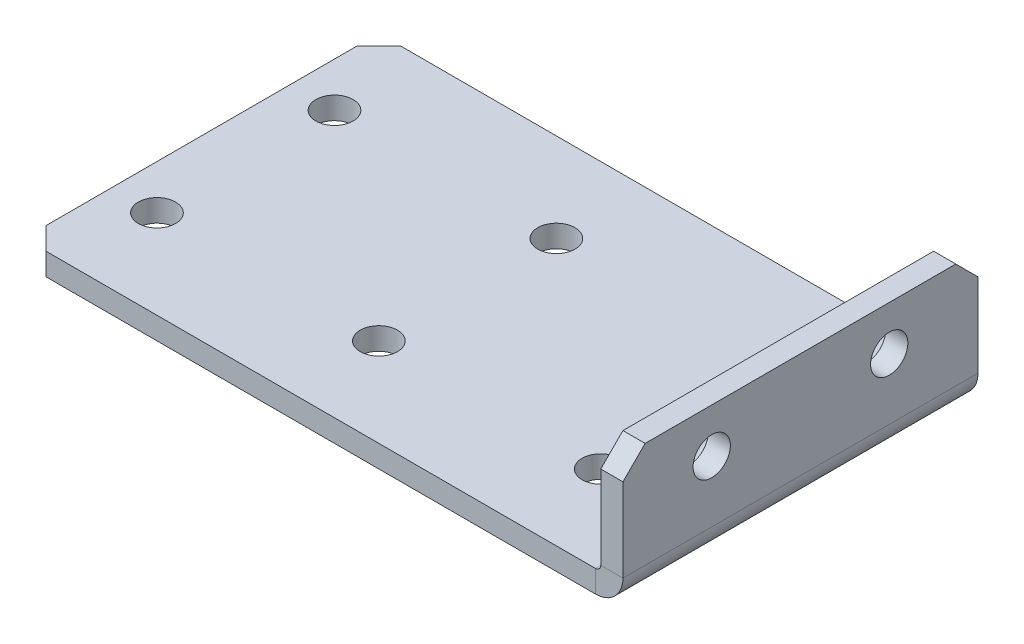
ISO-10303-21;
HEADER;
FILE_DESCRIPTION(('STEP AP214'),'2;1');
FILE_NAME('part.step','',(''),(''),'','','');
FILE_SCHEMA(('AUTOMOTIVE_DESIGN { 1 0 10303 214 1 1 1 1 }'));
ENDSEC;
DATA;
#1=APPLICATION_CONTEXT('core data for automotive mechanical design processes');
#2=APPLICATION_PROTOCOL_DEFINITION('international standard','automotive_design',2000,#1);
#3=PRODUCT_CONTEXT('',#1,'mechanical');
#4=PRODUCT('Part','Part','',(#3));
#5=PRODUCT_RELATED_PRODUCT_CATEGORY('part','',(#4));
#6=PRODUCT_DEFINITION_FORMATION('','',#4);
#7=PRODUCT_DEFINITION_CONTEXT('part definition',#1,'design');
#8=PRODUCT_DEFINITION('design','',#6,#7);
#9=PRODUCT_DEFINITION_SHAPE('','',#8);
#10=(LENGTH_UNIT() NAMED_UNIT(*) SI_UNIT(.MILLI.,.METRE.));
#11=(NAMED_UNIT(*) PLANE_ANGLE_UNIT() SI_UNIT($,.RADIAN.));
#12=(NAMED_UNIT(*) SI_UNIT($,.STERADIAN.) SOLID_ANGLE_UNIT());
#13=UNCERTAINTY_MEASURE_WITH_UNIT(LENGTH_MEASURE(1.E-05),#10,'distance_accuracy_value','');
#14=(GEOMETRIC_REPRESENTATION_CONTEXT(3) GLOBAL_UNCERTAINTY_ASSIGNED_CONTEXT((#13)) GLOBAL_UNIT_ASSIGNED_CONTEXT((#10,
#11,#12)) REPRESENTATION_CONTEXT('',''));
#15=CARTESIAN_POINT('',(0.,0.,0.));
#16=DIRECTION('',(0.,0.,1.));
#17=DIRECTION('',(1.,0.,0.));
#18=AXIS2_PLACEMENT_3D('',#15,#16,#17);
#19=CARTESIAN_POINT('',(82.5499999999997,-81.5415859698046,0.));
#20=DIRECTION('',(1.,0.,0.));
#21=DIRECTION('',(0.,0.,-1.));
#22=AXIS2_PLACEMENT_3D('',#19,#20,#21);
#23=PLANE('',#22);
#24=CARTESIAN_POINT('',(82.5500000000007,12.7000000000001,-50.8));
#25=DIRECTION('',(-1.,0.,0.));
#26=DIRECTION('',(0.,0.,1.));
#27=AXIS2_PLACEMENT_3D('',#24,#25,#26);
#28=CIRCLE('',#27,2.66699999999999);
#29=CARTESIAN_POINT('',(82.5500000000006,12.7000000000001,-48.133));
#30=VERTEX_POINT('',#29);
#31=EDGE_CURVE('E271',#30,#30,#28,.T.);
#32=ORIENTED_EDGE('',*,*,#31,.F.);
#33=EDGE_LOOP('',(#32));
#34=FACE_BOUND('',#33,.T.);
#35=CARTESIAN_POINT('',(82.5500000000006,12.7000000000001,-25.4));
#36=DIRECTION('',(-1.,0.,0.));
#37=DIRECTION('',(0.,0.,1.));
#38=AXIS2_PLACEMENT_3D('',#35,#36,#37);
#39=CIRCLE('',#38,2.66699999999999);
#40=CARTESIAN_POINT('',(82.5500000000005,12.7000000000001,-22.733));
#41=VERTEX_POINT('',#40);
#42=EDGE_CURVE('E262',#41,#41,#39,.T.);
#43=ORIENTED_EDGE('',*,*,#42,.F.);
#44=EDGE_LOOP('',(#43));
#45=FACE_BOUND('',#44,.T.);
#46=DIRECTION('',(0.,1.,0.));
#47=VECTOR('',#46,1.);
#48=CARTESIAN_POINT('',(82.5499999999997,-78.3665859698046,-63.5));
#49=LINE('',#48,#47);
#50=CARTESIAN_POINT('',(82.55,3.93699999999998,-63.5));
#51=VERTEX_POINT('',#50);
#52=CARTESIAN_POINT('',(82.55,15.875,-63.5));
#53=VERTEX_POINT('',#52);
#54=EDGE_CURVE('E67',#51,#53,#49,.T.);
#55=ORIENTED_EDGE('',*,*,#54,.F.);
#56=DIRECTION('',(0.,0.,1.));
#57=VECTOR('',#56,1.);
#58=CARTESIAN_POINT('',(82.55,3.93699999999997,0.));
#59=LINE('',#58,#57);
#60=CARTESIAN_POINT('',(82.55,3.93699999999997,-12.7));
#61=VERTEX_POINT('',#60);
#62=EDGE_CURVE('E56',#51,#61,#59,.T.);
#63=ORIENTED_EDGE('',*,*,#62,.T.);
#64=DIRECTION('',(0.,-1.,0.));
#65=VECTOR('',#64,1.);
#66=CARTESIAN_POINT('',(82.55,15.875,-12.7));
#67=LINE('',#66,#65);
#68=CARTESIAN_POINT('',(82.55,15.875,-12.7));
#69=VERTEX_POINT('',#68);
#70=EDGE_CURVE('E78',#69,#61,#67,.T.);
#71=ORIENTED_EDGE('',*,*,#70,.F.);
#72=DIRECTION('',(0.,-0.70710678118655,0.707106781186546));
#73=VECTOR('',#72,1.);
#74=CARTESIAN_POINT('',(82.5500000000001,19.05,-15.875));
#75=LINE('',#74,#73);
#76=CARTESIAN_POINT('',(82.5500000000001,19.05,-15.875));
#77=VERTEX_POINT('',#76);
#78=EDGE_CURVE('E280',#77,#69,#75,.T.);
#79=ORIENTED_EDGE('',*,*,#78,.F.);
#80=DIRECTION('',(0.,0.,1.));
#81=VECTOR('',#80,1.);
#82=CARTESIAN_POINT('',(82.55,19.05,-60.325));
#83=LINE('',#82,#81);
#84=CARTESIAN_POINT('',(82.55,19.05,-60.325));
#85=VERTEX_POINT('',#84);
#86=EDGE_CURVE('E289',#85,#77,#83,.T.);
#87=ORIENTED_EDGE('',*,*,#86,.F.);
#88=DIRECTION('',(0.,0.707106781186547,0.707106781186548));
#89=VECTOR('',#88,1.);
#90=CARTESIAN_POINT('',(82.55,15.875,-63.5));
#91=LINE('',#90,#89);
#92=EDGE_CURVE('E285',#53,#85,#91,.T.);
#93=ORIENTED_EDGE('',*,*,#92,.F.);
#94=EDGE_LOOP('',(#55,#63,#71,#79,#87,#93));
#95=FACE_BOUND('',#94,.T.);
#96=ADVANCED_FACE('F46',(#34,#45,#95),#23,.F.);
#97=CARTESIAN_POINT('',(82.5500000000001,19.05,-15.875));
#98=DIRECTION('',(0.,0.707106781186545,0.707106781186549));
#99=DIRECTION('',(0.,0.70710678118655,-0.707106781186546));
#100=AXIS2_PLACEMENT_3D('',#97,#98,#99);
#101=PLANE('',#100);
#102=DIRECTION('',(0.,-0.70710678118655,0.707106781186546));
#103=VECTOR('',#102,1.);
#104=CARTESIAN_POINT('',(85.725,19.05,-15.875));
#105=LINE('',#104,#103);
#106=CARTESIAN_POINT('',(85.725,19.05,-15.875));
#107=VERTEX_POINT('',#106);
#108=CARTESIAN_POINT('',(85.725,15.875,-12.7));
#109=VERTEX_POINT('',#108);
#110=EDGE_CURVE('E279',#107,#109,#105,.T.);
#111=ORIENTED_EDGE('',*,*,#110,.F.);
#112=DIRECTION('',(1.,0.,0.));
#113=VECTOR('',#112,1.);
#114=CARTESIAN_POINT('',(82.5500000000001,19.05,-15.875));
#115=LINE('',#114,#113);
#116=EDGE_CURVE('E305',#77,#107,#115,.T.);
#117=ORIENTED_EDGE('',*,*,#116,.F.);
#118=ORIENTED_EDGE('',*,*,#78,.T.);
#119=DIRECTION('',(1.,0.,0.));
#120=VECTOR('',#119,1.);
#121=CARTESIAN_POINT('',(82.55,15.875,-12.7));
#122=LINE('',#121,#120);
#123=EDGE_CURVE('E293',#69,#109,#122,.T.);
#124=ORIENTED_EDGE('',*,*,#123,.T.);
#125=EDGE_LOOP('',(#111,#117,#118,#124));
#126=FACE_BOUND('',#125,.T.);
#127=ADVANCED_FACE('F346',(#126),#101,.T.);
#128=CARTESIAN_POINT('',(82.55,19.05,-60.325));
#129=DIRECTION('',(0.,1.,0.));
#130=DIRECTION('',(0.,0.,-1.));
#131=AXIS2_PLACEMENT_3D('',#128,#129,#130);
#132=PLANE('',#131);
#133=DIRECTION('',(0.,0.,1.));
#134=VECTOR('',#133,1.);
#135=CARTESIAN_POINT('',(85.725,19.05,-60.325));
#136=LINE('',#135,#134);
#137=CARTESIAN_POINT('',(85.725,19.05,-60.325));
#138=VERTEX_POINT('',#137);
#139=EDGE_CURVE('E284',#138,#107,#136,.T.);
#140=ORIENTED_EDGE('',*,*,#139,.F.);
#141=DIRECTION('',(1.,0.,0.));
#142=VECTOR('',#141,1.);
#143=CARTESIAN_POINT('',(82.55,19.05,-60.325));
#144=LINE('',#143,#142);
#145=EDGE_CURVE('E308',#85,#138,#144,.T.);
#146=ORIENTED_EDGE('',*,*,#145,.F.);
#147=ORIENTED_EDGE('',*,*,#86,.T.);
#148=ORIENTED_EDGE('',*,*,#116,.T.);
#149=EDGE_LOOP('',(#140,#146,#147,#148));
#150=FACE_BOUND('',#149,.T.);
#151=ADVANCED_FACE('F343',(#150),#132,.T.);
#152=CARTESIAN_POINT('',(82.55,15.875,-63.5));
#153=DIRECTION('',(0.,0.707106781186548,-0.707106781186547));
#154=DIRECTION('',(0.,-0.707106781186547,-0.707106781186548));
#155=AXIS2_PLACEMENT_3D('',#152,#153,#154);
#156=PLANE('',#155);
#157=DIRECTION('',(0.,0.707106781186547,0.707106781186548));
#158=VECTOR('',#157,1.);
#159=CARTESIAN_POINT('',(85.725,15.875,-63.5));
#160=LINE('',#159,#158);
#161=CARTESIAN_POINT('',(85.725,15.875,-63.5));
#162=VERTEX_POINT('',#161);
#163=EDGE_CURVE('E298',#162,#138,#160,.T.);
#164=ORIENTED_EDGE('',*,*,#163,.F.);
#165=DIRECTION('',(1.,0.,0.));
#166=VECTOR('',#165,1.);
#167=CARTESIAN_POINT('',(82.55,15.875,-63.5));
#168=LINE('',#167,#166);
#169=EDGE_CURVE('E311',#53,#162,#168,.T.);
#170=ORIENTED_EDGE('',*,*,#169,.F.);
#171=ORIENTED_EDGE('',*,*,#92,.T.);
#172=ORIENTED_EDGE('',*,*,#145,.T.);
#173=EDGE_LOOP('',(#164,#170,#171,#172));
#174=FACE_BOUND('',#173,.T.);
#175=ADVANCED_FACE('F340',(#174),#156,.T.);
#176=CARTESIAN_POINT('',(82.5499999999997,-78.3665859698046,-63.5));
#177=DIRECTION('',(0.,0.,-1.));
#178=DIRECTION('',(0.,-1.,0.));
#179=AXIS2_PLACEMENT_3D('',#176,#177,#178);
#180=PLANE('',#179);
#181=DIRECTION('',(1.,0.,0.));
#182=VECTOR('',#181,1.);
#183=CARTESIAN_POINT('',(82.55,3.93699999999997,-63.5));
#184=LINE('',#183,#182);
#185=CARTESIAN_POINT('',(85.725,3.93699999999997,-63.5));
#186=VERTEX_POINT('',#185);
#187=EDGE_CURVE('E12',#51,#186,#184,.T.);
#188=ORIENTED_EDGE('',*,*,#187,.F.);
#189=ORIENTED_EDGE('',*,*,#54,.T.);
#190=ORIENTED_EDGE('',*,*,#169,.T.);
#191=DIRECTION('',(0.,1.,0.));
#192=VECTOR('',#191,1.);
#193=CARTESIAN_POINT('',(85.7249999999997,-78.3665859698046,-63.5));
#194=LINE('',#193,#192);
#195=EDGE_CURVE('E50',#186,#162,#194,.T.);
#196=ORIENTED_EDGE('',*,*,#195,.F.);
#197=EDGE_LOOP('',(#188,#189,#190,#196));
#198=FACE_BOUND('',#197,.T.);
#199=ADVANCED_FACE('F48',(#198),#180,.T.);
#200=CARTESIAN_POINT('',(82.55,15.875,-12.7));
#201=DIRECTION('',(0.,0.,1.));
#202=DIRECTION('',(0.,1.,0.));
#203=AXIS2_PLACEMENT_3D('',#200,#201,#202);
#204=PLANE('',#203);
#205=DIRECTION('',(-1.,0.,0.));
#206=VECTOR('',#205,1.);
#207=CARTESIAN_POINT('',(82.55,3.93699999999997,-12.7));
#208=LINE('',#207,#206);
#209=CARTESIAN_POINT('',(85.725,3.93699999999994,-12.7));
#210=VERTEX_POINT('',#209);
#211=EDGE_CURVE('E319',#210,#61,#208,.T.);
#212=ORIENTED_EDGE('',*,*,#211,.F.);
#213=DIRECTION('',(0.,-1.,0.));
#214=VECTOR('',#213,1.);
#215=CARTESIAN_POINT('',(85.725,15.875,-12.7));
#216=LINE('',#215,#214);
#217=EDGE_CURVE('E297',#109,#210,#216,.T.);
#218=ORIENTED_EDGE('',*,*,#217,.F.);
#219=ORIENTED_EDGE('',*,*,#123,.F.);
#220=ORIENTED_EDGE('',*,*,#70,.T.);
#221=EDGE_LOOP('',(#212,#218,#219,#220));
#222=FACE_BOUND('',#221,.T.);
#223=ADVANCED_FACE('F348',(#222),#204,.T.);
#224=CARTESIAN_POINT('',(85.7249999999997,-81.5415859698046,0.));
#225=DIRECTION('',(1.,0.,0.));
#226=DIRECTION('',(0.,0.,-1.));
#227=AXIS2_PLACEMENT_3D('',#224,#225,#226);
#228=PLANE('',#227);
#229=DIRECTION('',(0.,0.,1.));
#230=VECTOR('',#229,1.);
#231=CARTESIAN_POINT('',(85.725,3.93699999999995,0.));
#232=LINE('',#231,#230);
#233=EDGE_CURVE('E183',#186,#210,#232,.T.);
#234=ORIENTED_EDGE('',*,*,#233,.F.);
#235=ORIENTED_EDGE('',*,*,#195,.T.);
#236=ORIENTED_EDGE('',*,*,#163,.T.);
#237=ORIENTED_EDGE('',*,*,#139,.T.);
#238=ORIENTED_EDGE('',*,*,#110,.T.);
#239=ORIENTED_EDGE('',*,*,#217,.T.);
#240=EDGE_LOOP('',(#234,#235,#236,#237,#238,#239));
#241=FACE_BOUND('',#240,.T.);
#242=CARTESIAN_POINT('',(85.7250000000005,12.7,-25.4));
#243=DIRECTION('',(-1.,0.,0.));
#244=DIRECTION('',(0.,0.,1.));
#245=AXIS2_PLACEMENT_3D('',#242,#243,#244);
#246=CIRCLE('',#245,2.66699999999999);
#247=CARTESIAN_POINT('',(85.7250000000005,12.7,-22.733));
#248=VERTEX_POINT('',#247);
#249=EDGE_CURVE('E266',#248,#248,#246,.T.);
#250=ORIENTED_EDGE('',*,*,#249,.T.);
#251=EDGE_LOOP('',(#250));
#252=FACE_BOUND('',#251,.T.);
#253=CARTESIAN_POINT('',(85.7250000000006,12.7000000000001,-50.8));
#254=DIRECTION('',(-1.,0.,0.));
#255=DIRECTION('',(0.,0.,1.));
#256=AXIS2_PLACEMENT_3D('',#253,#254,#255);
#257=CIRCLE('',#256,2.66699999999999);
#258=CARTESIAN_POINT('',(85.7250000000006,12.7000000000001,-48.133));
#259=VERTEX_POINT('',#258);
#260=EDGE_CURVE('E275',#259,#259,#257,.T.);
#261=ORIENTED_EDGE('',*,*,#260,.T.);
#262=EDGE_LOOP('',(#261));
#263=FACE_BOUND('',#262,.T.);
#264=ADVANCED_FACE('F333',(#241,#252,#263),#228,.T.);
#265=CARTESIAN_POINT('',(82.5500000000007,12.7000000000001,-50.8));
#266=DIRECTION('',(-1.,0.,0.));
#267=DIRECTION('',(0.,0.,1.));
#268=AXIS2_PLACEMENT_3D('',#265,#266,#267);
#269=CYLINDRICAL_SURFACE('',#268,2.66699999999999);
#270=ORIENTED_EDGE('',*,*,#260,.F.);
#271=EDGE_LOOP('',(#270));
#272=FACE_BOUND('',#271,.T.);
#273=ORIENTED_EDGE('',*,*,#31,.T.);
#274=EDGE_LOOP('',(#273));
#275=FACE_BOUND('',#274,.T.);
#276=ADVANCED_FACE('F435',(#272,#275),#269,.F.);
#277=CARTESIAN_POINT('',(82.5500000000006,12.7000000000001,-25.4));
#278=DIRECTION('',(-1.,0.,0.));
#279=DIRECTION('',(0.,0.,1.));
#280=AXIS2_PLACEMENT_3D('',#277,#278,#279);
#281=CYLINDRICAL_SURFACE('',#280,2.66699999999999);
#282=ORIENTED_EDGE('',*,*,#249,.F.);
#283=EDGE_LOOP('',(#282));
#284=FACE_BOUND('',#283,.T.);
#285=ORIENTED_EDGE('',*,*,#42,.T.);
#286=EDGE_LOOP('',(#285));
#287=FACE_BOUND('',#286,.T.);
#288=ADVANCED_FACE('F443',(#284,#287),#281,.F.);
#289=CARTESIAN_POINT('',(0.,3.17499999999997,-60.325));
#290=DIRECTION('',(-0.707106781186547,0.,-0.707106781186547));
#291=DIRECTION('',(-0.707106781186548,0.,0.707106781186548));
#292=AXIS2_PLACEMENT_3D('',#289,#290,#291);
#293=PLANE('',#292);
#294=DIRECTION('',(0.707106781186547,0.,-0.707106781186548));
#295=VECTOR('',#294,1.);
#296=CARTESIAN_POINT('',(0.,0.,-60.325));
#297=LINE('',#296,#295);
#298=CARTESIAN_POINT('',(0.,0.,-60.325));
#299=VERTEX_POINT('',#298);
#300=CARTESIAN_POINT('',(3.17500000000001,0.,-63.5));
#301=VERTEX_POINT('',#300);
#302=EDGE_CURVE('E174',#299,#301,#297,.T.);
#303=ORIENTED_EDGE('',*,*,#302,.F.);
#304=DIRECTION('',(0.,-1.,0.));
#305=VECTOR('',#304,1.);
#306=CARTESIAN_POINT('',(0.,3.17499999999997,-60.325));
#307=LINE('',#306,#305);
#308=CARTESIAN_POINT('',(0.,3.17499999999997,-60.325));
#309=VERTEX_POINT('',#308);
#310=EDGE_CURVE('E247',#309,#299,#307,.T.);
#311=ORIENTED_EDGE('',*,*,#310,.F.);
#312=DIRECTION('',(0.707106781186547,0.,-0.707106781186548));
#313=VECTOR('',#312,1.);
#314=CARTESIAN_POINT('',(0.,3.17499999999997,-60.325));
#315=LINE('',#314,#313);
#316=CARTESIAN_POINT('',(3.17500000000001,3.17499999999997,-63.5));
#317=VERTEX_POINT('',#316);
#318=EDGE_CURVE('E257',#309,#317,#315,.T.);
#319=ORIENTED_EDGE('',*,*,#318,.T.);
#320=DIRECTION('',(0.,-1.,0.));
#321=VECTOR('',#320,1.);
#322=CARTESIAN_POINT('',(3.17500000000001,3.17499999999997,-63.5));
#323=LINE('',#322,#321);
#324=EDGE_CURVE('E254',#317,#301,#323,.T.);
#325=ORIENTED_EDGE('',*,*,#324,.T.);
#326=EDGE_LOOP('',(#303,#311,#319,#325));
#327=FACE_BOUND('',#326,.T.);
#328=ADVANCED_FACE('F407',(#327),#293,.T.);
#329=CARTESIAN_POINT('',(0.,3.17499999999997,-15.875));
#330=DIRECTION('',(-1.,0.,0.));
#331=DIRECTION('',(0.,0.,1.));
#332=AXIS2_PLACEMENT_3D('',#329,#330,#331);
#333=PLANE('',#332);
#334=DIRECTION('',(0.,0.,-1.));
#335=VECTOR('',#334,1.);
#336=CARTESIAN_POINT('',(0.,0.,-15.875));
#337=LINE('',#336,#335);
#338=CARTESIAN_POINT('',(0.,0.,-15.875));
#339=VERTEX_POINT('',#338);
#340=EDGE_CURVE('E210',#339,#299,#337,.T.);
#341=ORIENTED_EDGE('',*,*,#340,.F.);
#342=DIRECTION('',(0.,-1.,0.));
#343=VECTOR('',#342,1.);
#344=CARTESIAN_POINT('',(0.,3.17499999999997,-15.875));
#345=LINE('',#344,#343);
#346=CARTESIAN_POINT('',(0.,3.17499999999997,-15.875));
#347=VERTEX_POINT('',#346);
#348=EDGE_CURVE('E240',#347,#339,#345,.T.);
#349=ORIENTED_EDGE('',*,*,#348,.F.);
#350=DIRECTION('',(0.,0.,-1.));
#351=VECTOR('',#350,1.);
#352=CARTESIAN_POINT('',(0.,3.17499999999997,-15.875));
#353=LINE('',#352,#351);
#354=EDGE_CURVE('E250',#347,#309,#353,.T.);
#355=ORIENTED_EDGE('',*,*,#354,.T.);
#356=ORIENTED_EDGE('',*,*,#310,.T.);
#357=EDGE_LOOP('',(#341,#349,#355,#356));
#358=FACE_BOUND('',#357,.T.);
#359=ADVANCED_FACE('F403',(#358),#333,.T.);
#360=CARTESIAN_POINT('',(3.17500000000001,3.17499999999997,-12.7));
#361=DIRECTION('',(-0.707106781186547,0.,0.707106781186548));
#362=DIRECTION('',(0.707106781186548,0.,0.707106781186547));
#363=AXIS2_PLACEMENT_3D('',#360,#361,#362);
#364=PLANE('',#363);
#365=DIRECTION('',(-0.707106781186548,0.,-0.707106781186547));
#366=VECTOR('',#365,1.);
#367=CARTESIAN_POINT('',(3.17500000000001,0.,-12.7));
#368=LINE('',#367,#366);
#369=CARTESIAN_POINT('',(3.17500000000001,0.,-12.7));
#370=VERTEX_POINT('',#369);
#371=EDGE_CURVE('E205',#370,#339,#368,.T.);
#372=ORIENTED_EDGE('',*,*,#371,.F.);
#373=DIRECTION('',(0.,-1.,0.));
#374=VECTOR('',#373,1.);
#375=CARTESIAN_POINT('',(3.17500000000001,3.17499999999997,-12.7));
#376=LINE('',#375,#374);
#377=CARTESIAN_POINT('',(3.17500000000001,3.17499999999997,-12.7));
#378=VERTEX_POINT('',#377);
#379=EDGE_CURVE('E202',#378,#370,#376,.T.);
#380=ORIENTED_EDGE('',*,*,#379,.F.);
#381=DIRECTION('',(-0.707106781186548,0.,-0.707106781186547));
#382=VECTOR('',#381,1.);
#383=CARTESIAN_POINT('',(3.17500000000001,3.17499999999997,-12.7));
#384=LINE('',#383,#382);
#385=EDGE_CURVE('E243',#378,#347,#384,.T.);
#386=ORIENTED_EDGE('',*,*,#385,.T.);
#387=ORIENTED_EDGE('',*,*,#348,.T.);
#388=EDGE_LOOP('',(#372,#380,#386,#387));
#389=FACE_BOUND('',#388,.T.);
#390=ADVANCED_FACE('F479',(#389),#364,.T.);
#391=CARTESIAN_POINT('',(38.1,0.,-25.4));
#392=DIRECTION('',(0.,-1.,0.));
#393=DIRECTION('',(0.,0.,-1.));
#394=AXIS2_PLACEMENT_3D('',#391,#392,#393);
#395=CYLINDRICAL_SURFACE('',#394,2.66699999999999);
#396=CARTESIAN_POINT('',(38.1,3.17499999999997,-25.4));
#397=DIRECTION('',(0.,-1.,0.));
#398=DIRECTION('',(0.,0.,-1.));
#399=AXIS2_PLACEMENT_3D('',#396,#397,#398);
#400=CIRCLE('',#399,2.66699999999999);
#401=CARTESIAN_POINT('',(38.1,3.17499999999997,-28.067));
#402=VERTEX_POINT('',#401);
#403=EDGE_CURVE('E390',#402,#402,#400,.T.);
#404=ORIENTED_EDGE('',*,*,#403,.F.);
#405=EDGE_LOOP('',(#404));
#406=FACE_BOUND('',#405,.T.);
#407=CARTESIAN_POINT('',(38.1,0.,-25.4));
#408=DIRECTION('',(0.,-1.,0.));
#409=DIRECTION('',(0.,0.,-1.));
#410=AXIS2_PLACEMENT_3D('',#407,#408,#409);
#411=CIRCLE('',#410,2.66699999999999);
#412=CARTESIAN_POINT('',(38.1,0.,-28.067));
#413=VERTEX_POINT('',#412);
#414=EDGE_CURVE('E236',#413,#413,#411,.T.);
#415=ORIENTED_EDGE('',*,*,#414,.T.);
#416=EDGE_LOOP('',(#415));
#417=FACE_BOUND('',#416,.T.);
#418=ADVANCED_FACE('F475',(#406,#417),#395,.F.);
#419=CARTESIAN_POINT('',(38.1,0.,-50.8));
#420=DIRECTION('',(0.,-1.,0.));
#421=DIRECTION('',(0.,0.,-1.));
#422=AXIS2_PLACEMENT_3D('',#419,#420,#421);
#423=CYLINDRICAL_SURFACE('',#422,2.66699999999999);
#424=CARTESIAN_POINT('',(38.1,3.17499999999997,-50.8));
#425=DIRECTION('',(0.,-1.,0.));
#426=DIRECTION('',(0.,0.,-1.));
#427=AXIS2_PLACEMENT_3D('',#424,#425,#426);
#428=CIRCLE('',#427,2.66699999999999);
#429=CARTESIAN_POINT('',(38.1,3.17499999999997,-53.467));
#430=VERTEX_POINT('',#429);
#431=EDGE_CURVE('E386',#430,#430,#428,.T.);
#432=ORIENTED_EDGE('',*,*,#431,.F.);
#433=EDGE_LOOP('',(#432));
#434=FACE_BOUND('',#433,.T.);
#435=CARTESIAN_POINT('',(38.1,0.,-50.8));
#436=DIRECTION('',(0.,-1.,0.));
#437=DIRECTION('',(0.,0.,-1.));
#438=AXIS2_PLACEMENT_3D('',#435,#436,#437);
#439=CIRCLE('',#438,2.66699999999999);
#440=CARTESIAN_POINT('',(38.1,0.,-53.467));
#441=VERTEX_POINT('',#440);
#442=EDGE_CURVE('E232',#441,#441,#439,.T.);
#443=ORIENTED_EDGE('',*,*,#442,.T.);
#444=EDGE_LOOP('',(#443));
#445=FACE_BOUND('',#444,.T.);
#446=ADVANCED_FACE('F471',(#434,#445),#423,.F.);
#447=CARTESIAN_POINT('',(69.85,0.,-25.4));
#448=DIRECTION('',(0.,-1.,0.));
#449=DIRECTION('',(0.,0.,-1.));
#450=AXIS2_PLACEMENT_3D('',#447,#448,#449);
#451=CYLINDRICAL_SURFACE('',#450,2.66699999999999);
#452=CARTESIAN_POINT('',(69.85,3.17499999999997,-25.4));
#453=DIRECTION('',(0.,-1.,0.));
#454=DIRECTION('',(0.,0.,-1.));
#455=AXIS2_PLACEMENT_3D('',#452,#453,#454);
#456=CIRCLE('',#455,2.66699999999999);
#457=CARTESIAN_POINT('',(69.85,3.17499999999997,-28.067));
#458=VERTEX_POINT('',#457);
#459=EDGE_CURVE('E382',#458,#458,#456,.T.);
#460=ORIENTED_EDGE('',*,*,#459,.F.);
#461=EDGE_LOOP('',(#460));
#462=FACE_BOUND('',#461,.T.);
#463=CARTESIAN_POINT('',(69.85,0.,-25.4));
#464=DIRECTION('',(0.,-1.,0.));
#465=DIRECTION('',(0.,0.,-1.));
#466=AXIS2_PLACEMENT_3D('',#463,#464,#465);
#467=CIRCLE('',#466,2.66699999999999);
#468=CARTESIAN_POINT('',(69.85,0.,-28.067));
#469=VERTEX_POINT('',#468);
#470=EDGE_CURVE('E228',#469,#469,#467,.T.);
#471=ORIENTED_EDGE('',*,*,#470,.T.);
#472=EDGE_LOOP('',(#471));
#473=FACE_BOUND('',#472,.T.);
#474=ADVANCED_FACE('F467',(#462,#473),#451,.F.);
#475=CARTESIAN_POINT('',(69.85,0.,-50.8));
#476=DIRECTION('',(0.,-1.,0.));
#477=DIRECTION('',(0.,0.,-1.));
#478=AXIS2_PLACEMENT_3D('',#475,#476,#477);
#479=CYLINDRICAL_SURFACE('',#478,2.66699999999999);
#480=CARTESIAN_POINT('',(69.85,3.17499999999997,-50.8));
#481=DIRECTION('',(0.,-1.,0.));
#482=DIRECTION('',(0.,0.,-1.));
#483=AXIS2_PLACEMENT_3D('',#480,#481,#482);
#484=CIRCLE('',#483,2.66699999999999);
#485=CARTESIAN_POINT('',(69.85,3.17499999999997,-53.467));
#486=VERTEX_POINT('',#485);
#487=EDGE_CURVE('E378',#486,#486,#484,.T.);
#488=ORIENTED_EDGE('',*,*,#487,.F.);
#489=EDGE_LOOP('',(#488));
#490=FACE_BOUND('',#489,.T.);
#491=CARTESIAN_POINT('',(69.85,0.,-50.8));
#492=DIRECTION('',(0.,-1.,0.));
#493=DIRECTION('',(0.,0.,-1.));
#494=AXIS2_PLACEMENT_3D('',#491,#492,#493);
#495=CIRCLE('',#494,2.66699999999999);
#496=CARTESIAN_POINT('',(69.85,0.,-53.467));
#497=VERTEX_POINT('',#496);
#498=EDGE_CURVE('E224',#497,#497,#495,.T.);
#499=ORIENTED_EDGE('',*,*,#498,.T.);
#500=EDGE_LOOP('',(#499));
#501=FACE_BOUND('',#500,.T.);
#502=ADVANCED_FACE('F463',(#490,#501),#479,.F.);
#503=CARTESIAN_POINT('',(6.35,0.,-25.4));
#504=DIRECTION('',(0.,-1.,0.));
#505=DIRECTION('',(0.,0.,-1.));
#506=AXIS2_PLACEMENT_3D('',#503,#504,#505);
#507=CYLINDRICAL_SURFACE('',#506,2.66699999999999);
#508=CARTESIAN_POINT('',(6.35,3.17499999999997,-25.4));
#509=DIRECTION('',(0.,-1.,0.));
#510=DIRECTION('',(0.,0.,-1.));
#511=AXIS2_PLACEMENT_3D('',#508,#509,#510);
#512=CIRCLE('',#511,2.66699999999999);
#513=CARTESIAN_POINT('',(6.35,3.17499999999997,-28.067));
#514=VERTEX_POINT('',#513);
#515=EDGE_CURVE('E374',#514,#514,#512,.T.);
#516=ORIENTED_EDGE('',*,*,#515,.F.);
#517=EDGE_LOOP('',(#516));
#518=FACE_BOUND('',#517,.T.);
#519=CARTESIAN_POINT('',(6.35,0.,-25.4));
#520=DIRECTION('',(0.,-1.,0.));
#521=DIRECTION('',(0.,0.,-1.));
#522=AXIS2_PLACEMENT_3D('',#519,#520,#521);
#523=CIRCLE('',#522,2.66699999999999);
#524=CARTESIAN_POINT('',(6.35,0.,-28.067));
#525=VERTEX_POINT('',#524);
#526=EDGE_CURVE('E220',#525,#525,#523,.T.);
#527=ORIENTED_EDGE('',*,*,#526,.T.);
#528=EDGE_LOOP('',(#527));
#529=FACE_BOUND('',#528,.T.);
#530=ADVANCED_FACE('F459',(#518,#529),#507,.F.);
#531=CARTESIAN_POINT('',(6.34999999999999,0.,-50.8));
#532=DIRECTION('',(0.,-1.,0.));
#533=DIRECTION('',(0.,0.,-1.));
#534=AXIS2_PLACEMENT_3D('',#531,#532,#533);
#535=CYLINDRICAL_SURFACE('',#534,2.66699999999999);
#536=CARTESIAN_POINT('',(6.34999999999999,3.17499999999997,-50.8));
#537=DIRECTION('',(0.,-1.,0.));
#538=DIRECTION('',(0.,0.,-1.));
#539=AXIS2_PLACEMENT_3D('',#536,#537,#538);
#540=CIRCLE('',#539,2.66699999999999);
#541=CARTESIAN_POINT('',(6.34999999999999,3.17499999999997,-53.467));
#542=VERTEX_POINT('',#541);
#543=EDGE_CURVE('E370',#542,#542,#540,.T.);
#544=ORIENTED_EDGE('',*,*,#543,.F.);
#545=EDGE_LOOP('',(#544));
#546=FACE_BOUND('',#545,.T.);
#547=CARTESIAN_POINT('',(6.34999999999999,0.,-50.8));
#548=DIRECTION('',(0.,-1.,0.));
#549=DIRECTION('',(0.,0.,-1.));
#550=AXIS2_PLACEMENT_3D('',#547,#548,#549);
#551=CIRCLE('',#550,2.66699999999999);
#552=CARTESIAN_POINT('',(6.34999999999999,0.,-53.467));
#553=VERTEX_POINT('',#552);
#554=EDGE_CURVE('E216',#553,#553,#551,.T.);
#555=ORIENTED_EDGE('',*,*,#554,.T.);
#556=EDGE_LOOP('',(#555));
#557=FACE_BOUND('',#556,.T.);
#558=ADVANCED_FACE('F455',(#546,#557),#535,.F.);
#559=CARTESIAN_POINT('',(0.,0.,0.));
#560=DIRECTION('',(0.,-1.,0.));
#561=DIRECTION('',(0.,0.,-1.));
#562=AXIS2_PLACEMENT_3D('',#559,#560,#561);
#563=PLANE('',#562);
#564=ORIENTED_EDGE('',*,*,#554,.F.);
#565=EDGE_LOOP('',(#564));
#566=FACE_BOUND('',#565,.T.);
#567=ORIENTED_EDGE('',*,*,#526,.F.);
#568=EDGE_LOOP('',(#567));
#569=FACE_BOUND('',#568,.T.);
#570=ORIENTED_EDGE('',*,*,#498,.F.);
#571=EDGE_LOOP('',(#570));
#572=FACE_BOUND('',#571,.T.);
#573=ORIENTED_EDGE('',*,*,#470,.F.);
#574=EDGE_LOOP('',(#573));
#575=FACE_BOUND('',#574,.T.);
#576=ORIENTED_EDGE('',*,*,#442,.F.);
#577=EDGE_LOOP('',(#576));
#578=FACE_BOUND('',#577,.T.);
#579=ORIENTED_EDGE('',*,*,#414,.F.);
#580=EDGE_LOOP('',(#579));
#581=FACE_BOUND('',#580,.T.);
#582=DIRECTION('',(1.,0.,0.));
#583=VECTOR('',#582,1.);
#584=CARTESIAN_POINT('',(3.17500000000001,0.,-63.5));
#585=LINE('',#584,#583);
#586=CARTESIAN_POINT('',(81.788,0.,-63.5));
#587=VERTEX_POINT('',#586);
#588=EDGE_CURVE('E196',#301,#587,#585,.T.);
#589=ORIENTED_EDGE('',*,*,#588,.T.);
#590=DIRECTION('',(0.,0.,1.));
#591=VECTOR('',#590,1.);
#592=CARTESIAN_POINT('',(81.788,0.,0.));
#593=LINE('',#592,#591);
#594=CARTESIAN_POINT('',(81.788,0.,-12.7));
#595=VERTEX_POINT('',#594);
#596=EDGE_CURVE('E181',#587,#595,#593,.T.);
#597=ORIENTED_EDGE('',*,*,#596,.T.);
#598=DIRECTION('',(-1.,0.,0.));
#599=VECTOR('',#598,1.);
#600=CARTESIAN_POINT('',(97.4165859698046,0.,-12.7));
#601=LINE('',#600,#599);
#602=EDGE_CURVE('E192',#595,#370,#601,.T.);
#603=ORIENTED_EDGE('',*,*,#602,.T.);
#604=ORIENTED_EDGE('',*,*,#371,.T.);
#605=ORIENTED_EDGE('',*,*,#340,.T.);
#606=ORIENTED_EDGE('',*,*,#302,.T.);
#607=EDGE_LOOP('',(#589,#597,#603,#604,#605,#606));
#608=FACE_BOUND('',#607,.T.);
#609=ADVANCED_FACE('F190',(#566,#569,#572,#575,#578,#581,#608),#563,.T.);
#610=CARTESIAN_POINT('',(97.4165859698046,3.17499999999997,-12.7));
#611=DIRECTION('',(0.,0.,1.));
#612=DIRECTION('',(1.,0.,0.));
#613=AXIS2_PLACEMENT_3D('',#610,#611,#612);
#614=PLANE('',#613);
#615=ORIENTED_EDGE('',*,*,#602,.F.);
#616=DIRECTION('',(0.,1.,0.));
#617=VECTOR('',#616,1.);
#618=CARTESIAN_POINT('',(81.788,3.17499999999997,-12.7));
#619=LINE('',#618,#617);
#620=CARTESIAN_POINT('',(81.788,3.17499999999997,-12.7));
#621=VERTEX_POINT('',#620);
#622=EDGE_CURVE('E162',#595,#621,#619,.T.);
#623=ORIENTED_EDGE('',*,*,#622,.T.);
#624=DIRECTION('',(-1.,0.,0.));
#625=VECTOR('',#624,1.);
#626=CARTESIAN_POINT('',(97.4165859698046,3.17499999999997,-12.7));
#627=LINE('',#626,#625);
#628=EDGE_CURVE('E173',#621,#378,#627,.T.);
#629=ORIENTED_EDGE('',*,*,#628,.T.);
#630=ORIENTED_EDGE('',*,*,#379,.T.);
#631=EDGE_LOOP('',(#615,#623,#629,#630));
#632=FACE_BOUND('',#631,.T.);
#633=ADVANCED_FACE('F200',(#632),#614,.T.);
#634=CARTESIAN_POINT('',(0.,3.17499999999997,0.));
#635=DIRECTION('',(0.,-1.,0.));
#636=DIRECTION('',(0.,0.,-1.));
#637=AXIS2_PLACEMENT_3D('',#634,#635,#636);
#638=PLANE('',#637);
#639=DIRECTION('',(0.,0.,1.));
#640=VECTOR('',#639,1.);
#641=CARTESIAN_POINT('',(81.788,3.17499999999997,0.));
#642=LINE('',#641,#640);
#643=CARTESIAN_POINT('',(81.788,3.17499999999997,-63.5));
#644=VERTEX_POINT('',#643);
#645=EDGE_CURVE('E185',#644,#621,#642,.T.);
#646=ORIENTED_EDGE('',*,*,#645,.F.);
#647=DIRECTION('',(1.,0.,0.));
#648=VECTOR('',#647,1.);
#649=CARTESIAN_POINT('',(3.17500000000001,3.17499999999997,-63.5));
#650=LINE('',#649,#648);
#651=EDGE_CURVE('E366',#317,#644,#650,.T.);
#652=ORIENTED_EDGE('',*,*,#651,.F.);
#653=ORIENTED_EDGE('',*,*,#318,.F.);
#654=ORIENTED_EDGE('',*,*,#354,.F.);
#655=ORIENTED_EDGE('',*,*,#385,.F.);
#656=ORIENTED_EDGE('',*,*,#628,.F.);
#657=EDGE_LOOP('',(#646,#652,#653,#654,#655,#656));
#658=FACE_BOUND('',#657,.T.);
#659=ORIENTED_EDGE('',*,*,#403,.T.);
#660=EDGE_LOOP('',(#659));
#661=FACE_BOUND('',#660,.T.);
#662=ORIENTED_EDGE('',*,*,#431,.T.);
#663=EDGE_LOOP('',(#662));
#664=FACE_BOUND('',#663,.T.);
#665=ORIENTED_EDGE('',*,*,#459,.T.);
#666=EDGE_LOOP('',(#665));
#667=FACE_BOUND('',#666,.T.);
#668=ORIENTED_EDGE('',*,*,#487,.T.);
#669=EDGE_LOOP('',(#668));
#670=FACE_BOUND('',#669,.T.);
#671=ORIENTED_EDGE('',*,*,#515,.T.);
#672=EDGE_LOOP('',(#671));
#673=FACE_BOUND('',#672,.T.);
#674=ORIENTED_EDGE('',*,*,#543,.T.);
#675=EDGE_LOOP('',(#674));
#676=FACE_BOUND('',#675,.T.);
#677=ADVANCED_FACE('F420',(#658,#661,#664,#667,#670,#673,#676),#638,.F.);
#678=CARTESIAN_POINT('',(3.17500000000001,3.17499999999997,-63.5));
#679=DIRECTION('',(0.,0.,-1.));
#680=DIRECTION('',(-1.,0.,0.));
#681=AXIS2_PLACEMENT_3D('',#678,#679,#680);
#682=PLANE('',#681);
#683=ORIENTED_EDGE('',*,*,#651,.T.);
#684=DIRECTION('',(0.,-1.,0.));
#685=VECTOR('',#684,1.);
#686=CARTESIAN_POINT('',(81.788,3.17499999999997,-63.5));
#687=LINE('',#686,#685);
#688=EDGE_CURVE('E267',#644,#587,#687,.T.);
#689=ORIENTED_EDGE('',*,*,#688,.T.);
#690=ORIENTED_EDGE('',*,*,#588,.F.);
#691=ORIENTED_EDGE('',*,*,#324,.F.);
#692=EDGE_LOOP('',(#683,#689,#690,#691));
#693=FACE_BOUND('',#692,.T.);
#694=ADVANCED_FACE('F410',(#693),#682,.T.);
#695=CARTESIAN_POINT('',(81.788,3.93699999999997,-63.5));
#696=DIRECTION('',(0.,0.,-1.));
#697=DIRECTION('',(-1.,0.,0.));
#698=AXIS2_PLACEMENT_3D('',#695,#696,#697);
#699=PLANE('',#698);
#700=ORIENTED_EDGE('',*,*,#688,.F.);
#701=CARTESIAN_POINT('',(81.788,3.93699999999997,-63.5));
#702=DIRECTION('',(0.,0.,1.));
#703=DIRECTION('',(1.,0.,0.));
#704=AXIS2_PLACEMENT_3D('',#701,#702,#703);
#705=CIRCLE('',#704,0.761999999999999);
#706=EDGE_CURVE('E357',#644,#51,#705,.T.);
#707=ORIENTED_EDGE('',*,*,#706,.T.);
#708=ORIENTED_EDGE('',*,*,#187,.T.);
#709=CARTESIAN_POINT('',(81.788,3.93699999999997,-63.5));
#710=DIRECTION('',(0.,0.,1.));
#711=DIRECTION('',(1.,0.,0.));
#712=AXIS2_PLACEMENT_3D('',#709,#710,#711);
#713=CIRCLE('',#712,3.93699999999998);
#714=EDGE_CURVE('E186',#587,#186,#713,.T.);
#715=ORIENTED_EDGE('',*,*,#714,.F.);
#716=EDGE_LOOP('',(#700,#707,#708,#715));
#717=FACE_BOUND('',#716,.T.);
#718=ADVANCED_FACE('F412',(#717),#699,.T.);
#719=CARTESIAN_POINT('',(81.788,3.93699999999997,-12.7));
#720=DIRECTION('',(0.,0.,1.));
#721=DIRECTION('',(1.,0.,0.));
#722=AXIS2_PLACEMENT_3D('',#719,#720,#721);
#723=PLANE('',#722);
#724=CARTESIAN_POINT('',(81.788,3.93699999999997,-12.7));
#725=DIRECTION('',(0.,0.,1.));
#726=DIRECTION('',(1.,0.,0.));
#727=AXIS2_PLACEMENT_3D('',#724,#725,#726);
#728=CIRCLE('',#727,0.761999999999999);
#729=EDGE_CURVE('E168',#61,#621,#728,.F.);
#730=ORIENTED_EDGE('',*,*,#729,.T.);
#731=ORIENTED_EDGE('',*,*,#622,.F.);
#732=CARTESIAN_POINT('',(81.788,3.93699999999997,-12.7));
#733=DIRECTION('',(0.,0.,-1.));
#734=DIRECTION('',(-1.,0.,0.));
#735=AXIS2_PLACEMENT_3D('',#732,#733,#734);
#736=CIRCLE('',#735,3.93699999999998);
#737=EDGE_CURVE('E166',#210,#595,#736,.T.);
#738=ORIENTED_EDGE('',*,*,#737,.F.);
#739=ORIENTED_EDGE('',*,*,#211,.T.);
#740=EDGE_LOOP('',(#730,#731,#738,#739));
#741=FACE_BOUND('',#740,.T.);
#742=ADVANCED_FACE('F164',(#741),#723,.T.);
#743=CARTESIAN_POINT('',(81.788,3.93699999999997,-89.1327448781713));
#744=DIRECTION('',(0.,0.,1.));
#745=DIRECTION('',(1.,0.,0.));
#746=AXIS2_PLACEMENT_3D('',#743,#744,#745);
#747=CYLINDRICAL_SURFACE('',#746,3.93699999999997);
#748=ORIENTED_EDGE('',*,*,#233,.T.);
#749=ORIENTED_EDGE('',*,*,#737,.T.);
#750=ORIENTED_EDGE('',*,*,#596,.F.);
#751=ORIENTED_EDGE('',*,*,#714,.T.);
#752=EDGE_LOOP('',(#748,#749,#750,#751));
#753=FACE_BOUND('',#752,.T.);
#754=ADVANCED_FACE('F179',(#753),#747,.T.);
#755=CARTESIAN_POINT('',(81.788,3.93699999999997,-89.1327448781713));
#756=DIRECTION('',(0.,0.,1.));
#757=DIRECTION('',(1.,0.,0.));
#758=AXIS2_PLACEMENT_3D('',#755,#756,#757);
#759=CYLINDRICAL_SURFACE('',#758,0.761999999999999);
#760=ORIENTED_EDGE('',*,*,#62,.F.);
#761=ORIENTED_EDGE('',*,*,#706,.F.);
#762=ORIENTED_EDGE('',*,*,#645,.T.);
#763=ORIENTED_EDGE('',*,*,#729,.F.);
#764=EDGE_LOOP('',(#760,#761,#762,#763));
#765=FACE_BOUND('',#764,.T.);
#766=ADVANCED_FACE('F351',(#765),#759,.F.);
#767=CLOSED_SHELL('',(#96,#127,#151,#175,#199,#223,#264,#276,#288,#328,#359,#390,#418,#446,#474,
#502,#530,#558,#609,#633,#677,#694,#718,#742,#754,#766));
#768=MANIFOLD_SOLID_BREP('B2',#767);
#769=ADVANCED_BREP_SHAPE_REPRESENTATION('',(#18,#768),#14);
#770=SHAPE_DEFINITION_REPRESENTATION(#9,#769);
ENDSEC;
END-ISO-10303-21;
